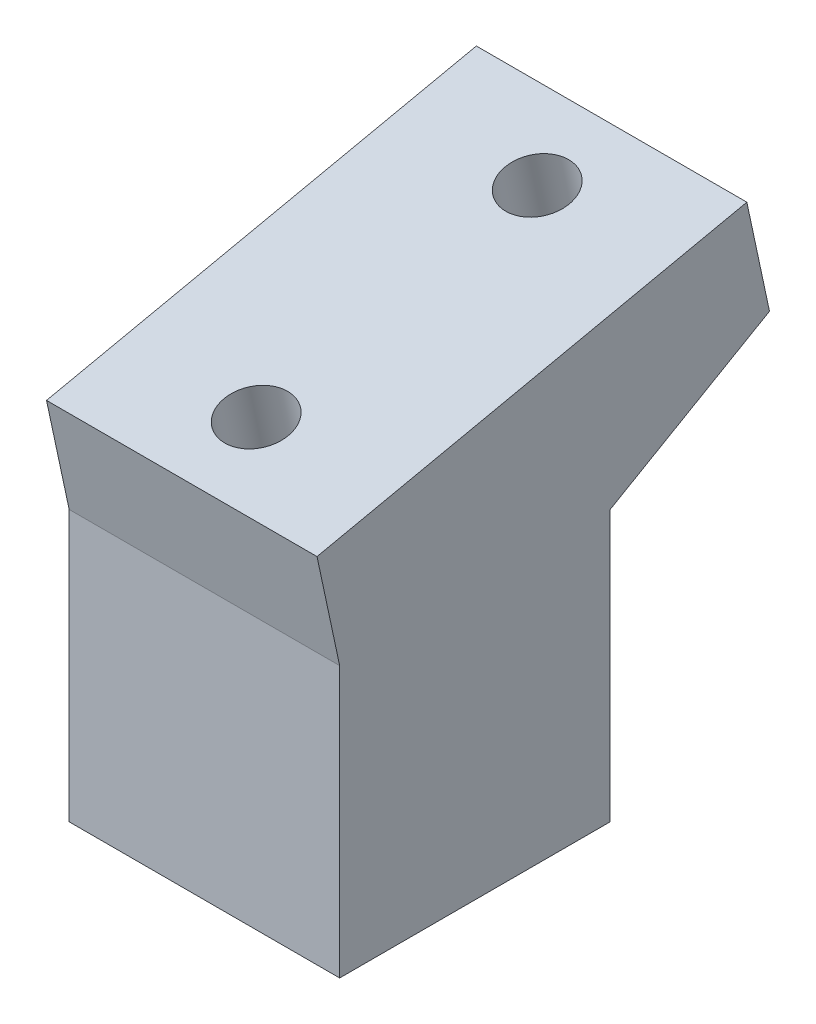
ISO-10303-21;
HEADER;
FILE_DESCRIPTION(('STEP AP214'),'2;1');
FILE_NAME('part.step','',(''),(''),'','','');
FILE_SCHEMA(('AUTOMOTIVE_DESIGN { 1 0 10303 214 1 1 1 1 }'));
ENDSEC;
DATA;
#1=APPLICATION_CONTEXT('core data for automotive mechanical design processes');
#2=APPLICATION_PROTOCOL_DEFINITION('international standard','automotive_design',2000,#1);
#3=PRODUCT_CONTEXT('',#1,'mechanical');
#4=PRODUCT('Part','Part','',(#3));
#5=PRODUCT_RELATED_PRODUCT_CATEGORY('part','',(#4));
#6=PRODUCT_DEFINITION_FORMATION('','',#4);
#7=PRODUCT_DEFINITION_CONTEXT('part definition',#1,'design');
#8=PRODUCT_DEFINITION('design','',#6,#7);
#9=PRODUCT_DEFINITION_SHAPE('','',#8);
#10=(LENGTH_UNIT() NAMED_UNIT(*) SI_UNIT(.MILLI.,.METRE.));
#11=(NAMED_UNIT(*) PLANE_ANGLE_UNIT() SI_UNIT($,.RADIAN.));
#12=(NAMED_UNIT(*) SI_UNIT($,.STERADIAN.) SOLID_ANGLE_UNIT());
#13=UNCERTAINTY_MEASURE_WITH_UNIT(LENGTH_MEASURE(1.E-05),#10,'distance_accuracy_value','');
#14=(GEOMETRIC_REPRESENTATION_CONTEXT(3) GLOBAL_UNCERTAINTY_ASSIGNED_CONTEXT((#13)) GLOBAL_UNIT_ASSIGNED_CONTEXT((#10,
#11,#12)) REPRESENTATION_CONTEXT('',''));
#15=CARTESIAN_POINT('',(0.,0.,0.));
#16=DIRECTION('',(0.,0.,1.));
#17=DIRECTION('',(1.,0.,0.));
#18=AXIS2_PLACEMENT_3D('',#15,#16,#17);
#19=CARTESIAN_POINT('',(0.,0.,0.));
#20=DIRECTION('',(0.,-1.,0.));
#21=DIRECTION('',(0.,0.,-1.));
#22=AXIS2_PLACEMENT_3D('',#19,#20,#21);
#23=PLANE('',#22);
#24=DIRECTION('',(0.,0.,1.));
#25=VECTOR('',#24,1.);
#26=CARTESIAN_POINT('',(0.,0.,0.));
#27=LINE('',#26,#25);
#28=CARTESIAN_POINT('',(0.,0.,-8.));
#29=VERTEX_POINT('',#28);
#30=CARTESIAN_POINT('',(0.,0.,0.));
#31=VERTEX_POINT('',#30);
#32=EDGE_CURVE('E249',#29,#31,#27,.T.);
#33=ORIENTED_EDGE('',*,*,#32,.F.);
#34=DIRECTION('',(-1.,0.,0.));
#35=VECTOR('',#34,1.);
#36=CARTESIAN_POINT('',(0.,0.,-8.));
#37=LINE('',#36,#35);
#38=CARTESIAN_POINT('',(8.,0.,-8.));
#39=VERTEX_POINT('',#38);
#40=EDGE_CURVE('E257',#39,#29,#37,.T.);
#41=ORIENTED_EDGE('',*,*,#40,.F.);
#42=DIRECTION('',(0.,0.,-1.));
#43=VECTOR('',#42,1.);
#44=CARTESIAN_POINT('',(8.,0.,0.));
#45=LINE('',#44,#43);
#46=CARTESIAN_POINT('',(8.,0.,0.));
#47=VERTEX_POINT('',#46);
#48=EDGE_CURVE('E260',#47,#39,#45,.T.);
#49=ORIENTED_EDGE('',*,*,#48,.F.);
#50=DIRECTION('',(1.,0.,0.));
#51=VECTOR('',#50,1.);
#52=CARTESIAN_POINT('',(0.,0.,0.));
#53=LINE('',#52,#51);
#54=EDGE_CURVE('E255',#31,#47,#53,.T.);
#55=ORIENTED_EDGE('',*,*,#54,.F.);
#56=EDGE_LOOP('',(#33,#41,#49,#55));
#57=FACE_BOUND('',#56,.T.);
#58=DIRECTION('',(-1.,0.,0.));
#59=VECTOR('',#58,1.);
#60=CARTESIAN_POINT('',(2.475,0.,-5.525));
#61=LINE('',#60,#59);
#62=CARTESIAN_POINT('',(5.525,0.,-5.525));
#63=VERTEX_POINT('',#62);
#64=CARTESIAN_POINT('',(2.475,0.,-5.525));
#65=VERTEX_POINT('',#64);
#66=EDGE_CURVE('E213',#63,#65,#61,.T.);
#67=ORIENTED_EDGE('',*,*,#66,.T.);
#68=DIRECTION('',(0.,0.,1.));
#69=VECTOR('',#68,1.);
#70=CARTESIAN_POINT('',(2.475,0.,-2.475));
#71=LINE('',#70,#69);
#72=CARTESIAN_POINT('',(2.475,0.,-2.475));
#73=VERTEX_POINT('',#72);
#74=EDGE_CURVE('E68',#65,#73,#71,.T.);
#75=ORIENTED_EDGE('',*,*,#74,.T.);
#76=DIRECTION('',(1.,0.,0.));
#77=VECTOR('',#76,1.);
#78=CARTESIAN_POINT('',(2.475,0.,-2.475));
#79=LINE('',#78,#77);
#80=CARTESIAN_POINT('',(5.525,0.,-2.475));
#81=VERTEX_POINT('',#80);
#82=EDGE_CURVE('E230',#73,#81,#79,.T.);
#83=ORIENTED_EDGE('',*,*,#82,.T.);
#84=DIRECTION('',(0.,0.,-1.));
#85=VECTOR('',#84,1.);
#86=CARTESIAN_POINT('',(5.525,0.,-2.475));
#87=LINE('',#86,#85);
#88=EDGE_CURVE('E235',#81,#63,#87,.T.);
#89=ORIENTED_EDGE('',*,*,#88,.T.);
#90=EDGE_LOOP('',(#67,#75,#83,#89));
#91=FACE_BOUND('',#90,.T.);
#92=ADVANCED_FACE('F50',(#57,#91),#23,.T.);
#93=CARTESIAN_POINT('',(0.,7.5,0.));
#94=DIRECTION('',(1.,0.,0.));
#95=DIRECTION('',(0.,0.,-1.));
#96=AXIS2_PLACEMENT_3D('',#93,#94,#95);
#97=PLANE('',#96);
#98=ORIENTED_EDGE('',*,*,#32,.T.);
#99=DIRECTION('',(0.,-1.,0.));
#100=VECTOR('',#99,1.);
#101=CARTESIAN_POINT('',(0.,7.5,0.));
#102=LINE('',#101,#100);
#103=CARTESIAN_POINT('',(0.,8.,0.));
#104=VERTEX_POINT('',#103);
#105=EDGE_CURVE('E139',#104,#31,#102,.T.);
#106=ORIENTED_EDGE('',*,*,#105,.F.);
#107=DIRECTION('',(0.,-0.977857126370329,-0.209273601791443));
#108=VECTOR('',#107,1.);
#109=CARTESIAN_POINT('',(0.,0.350363523254109,-1.63711746298359));
#110=LINE('',#109,#108);
#111=CARTESIAN_POINT('',(0.,11.1291428043851,0.669675525732618));
#112=VERTEX_POINT('',#111);
#113=EDGE_CURVE('E157',#112,#104,#110,.T.);
#114=ORIENTED_EDGE('',*,*,#113,.F.);
#115=DIRECTION('',(0.,-0.209273601791443,0.977857126370329));
#116=VECTOR('',#115,1.);
#117=CARTESIAN_POINT('',(0.,10.7787792811309,2.30679298871621));
#118=LINE('',#117,#116);
#119=CARTESIAN_POINT('',(0.,13.8496996276738,-12.0424671170816));
#120=VERTEX_POINT('',#119);
#121=EDGE_CURVE('E163',#120,#112,#118,.T.);
#122=ORIENTED_EDGE('',*,*,#121,.F.);
#123=DIRECTION('',(0.,0.977857126370328,0.209273601791444));
#124=VECTOR('',#123,1.);
#125=CARTESIAN_POINT('',(0.,3.07092034654288,-14.3492601057979));
#126=LINE('',#125,#124);
#127=CARTESIAN_POINT('',(0.,10.7205568232888,-12.7121426428143));
#128=VERTEX_POINT('',#127);
#129=EDGE_CURVE('E169',#128,#120,#126,.T.);
#130=ORIENTED_EDGE('',*,*,#129,.F.);
#131=DIRECTION('',(0.,-0.500000000000004,0.866025403784436));
#132=VECTOR('',#131,1.);
#133=CARTESIAN_POINT('',(0.,2.53589838486219,1.46410161513774));
#134=LINE('',#133,#132);
#135=CARTESIAN_POINT('',(0.,8.,-8.));
#136=VERTEX_POINT('',#135);
#137=EDGE_CURVE('E162',#128,#136,#134,.T.);
#138=ORIENTED_EDGE('',*,*,#137,.T.);
#139=DIRECTION('',(0.,-1.,0.));
#140=VECTOR('',#139,1.);
#141=CARTESIAN_POINT('',(0.,7.5,-8.));
#142=LINE('',#141,#140);
#143=EDGE_CURVE('E263',#136,#29,#142,.T.);
#144=ORIENTED_EDGE('',*,*,#143,.T.);
#145=EDGE_LOOP('',(#98,#106,#114,#122,#130,#138,#144));
#146=FACE_BOUND('',#145,.T.);
#147=ADVANCED_FACE('F47',(#146),#97,.F.);
#148=CARTESIAN_POINT('',(0.,7.5,0.));
#149=DIRECTION('',(0.,0.,-1.));
#150=DIRECTION('',(-1.,0.,0.));
#151=AXIS2_PLACEMENT_3D('',#148,#149,#150);
#152=PLANE('',#151);
#153=ORIENTED_EDGE('',*,*,#54,.T.);
#154=DIRECTION('',(0.,-1.,0.));
#155=VECTOR('',#154,1.);
#156=CARTESIAN_POINT('',(8.,7.5,0.));
#157=LINE('',#156,#155);
#158=CARTESIAN_POINT('',(8.,8.,0.));
#159=VERTEX_POINT('',#158);
#160=EDGE_CURVE('E271',#159,#47,#157,.T.);
#161=ORIENTED_EDGE('',*,*,#160,.F.);
#162=DIRECTION('',(1.,0.,0.));
#163=VECTOR('',#162,1.);
#164=CARTESIAN_POINT('',(0.,8.,0.));
#165=LINE('',#164,#163);
#166=EDGE_CURVE('E204',#104,#159,#165,.T.);
#167=ORIENTED_EDGE('',*,*,#166,.F.);
#168=ORIENTED_EDGE('',*,*,#105,.T.);
#169=EDGE_LOOP('',(#153,#161,#167,#168));
#170=FACE_BOUND('',#169,.T.);
#171=ADVANCED_FACE('F276',(#170),#152,.F.);
#172=CARTESIAN_POINT('',(8.,7.5,0.));
#173=DIRECTION('',(-1.,0.,0.));
#174=DIRECTION('',(0.,0.,1.));
#175=AXIS2_PLACEMENT_3D('',#172,#173,#174);
#176=PLANE('',#175);
#177=ORIENTED_EDGE('',*,*,#48,.T.);
#178=DIRECTION('',(0.,-1.,0.));
#179=VECTOR('',#178,1.);
#180=CARTESIAN_POINT('',(8.,7.5,-8.));
#181=LINE('',#180,#179);
#182=CARTESIAN_POINT('',(8.,8.,-8.));
#183=VERTEX_POINT('',#182);
#184=EDGE_CURVE('E270',#183,#39,#181,.T.);
#185=ORIENTED_EDGE('',*,*,#184,.F.);
#186=DIRECTION('',(0.,0.500000000000004,-0.866025403784436));
#187=VECTOR('',#186,1.);
#188=CARTESIAN_POINT('',(8.,2.53589838486219,1.46410161513774));
#189=LINE('',#188,#187);
#190=CARTESIAN_POINT('',(8.,10.7205568232888,-12.7121426428143));
#191=VERTEX_POINT('',#190);
#192=EDGE_CURVE('E183',#183,#191,#189,.T.);
#193=ORIENTED_EDGE('',*,*,#192,.T.);
#194=DIRECTION('',(0.,-0.977857126370329,-0.209273601791444));
#195=VECTOR('',#194,1.);
#196=CARTESIAN_POINT('',(8.,3.07092034654288,-14.3492601057979));
#197=LINE('',#196,#195);
#198=CARTESIAN_POINT('',(8.,13.8496996276738,-12.0424671170816));
#199=VERTEX_POINT('',#198);
#200=EDGE_CURVE('E175',#199,#191,#197,.T.);
#201=ORIENTED_EDGE('',*,*,#200,.F.);
#202=DIRECTION('',(0.,0.209273601791443,-0.977857126370329));
#203=VECTOR('',#202,1.);
#204=CARTESIAN_POINT('',(8.,10.7787792811309,2.30679298871621));
#205=LINE('',#204,#203);
#206=CARTESIAN_POINT('',(8.,11.1291428043851,0.669675525732618));
#207=VERTEX_POINT('',#206);
#208=EDGE_CURVE('E180',#207,#199,#205,.T.);
#209=ORIENTED_EDGE('',*,*,#208,.F.);
#210=DIRECTION('',(0.,0.977857126370329,0.209273601791443));
#211=VECTOR('',#210,1.);
#212=CARTESIAN_POINT('',(8.,0.350363523254109,-1.63711746298359));
#213=LINE('',#212,#211);
#214=EDGE_CURVE('E182',#159,#207,#213,.T.);
#215=ORIENTED_EDGE('',*,*,#214,.F.);
#216=ORIENTED_EDGE('',*,*,#160,.T.);
#217=EDGE_LOOP('',(#177,#185,#193,#201,#209,#215,#216));
#218=FACE_BOUND('',#217,.T.);
#219=ADVANCED_FACE('F287',(#218),#176,.F.);
#220=CARTESIAN_POINT('',(0.,7.5,-8.));
#221=DIRECTION('',(0.,0.,1.));
#222=DIRECTION('',(1.,0.,0.));
#223=AXIS2_PLACEMENT_3D('',#220,#221,#222);
#224=PLANE('',#223);
#225=ORIENTED_EDGE('',*,*,#40,.T.);
#226=ORIENTED_EDGE('',*,*,#143,.F.);
#227=DIRECTION('',(-1.,0.,0.));
#228=VECTOR('',#227,1.);
#229=CARTESIAN_POINT('',(8.,8.,-8.));
#230=LINE('',#229,#228);
#231=EDGE_CURVE('E171',#183,#136,#230,.T.);
#232=ORIENTED_EDGE('',*,*,#231,.F.);
#233=ORIENTED_EDGE('',*,*,#184,.T.);
#234=EDGE_LOOP('',(#225,#226,#232,#233));
#235=FACE_BOUND('',#234,.T.);
#236=ADVANCED_FACE('F295',(#235),#224,.F.);
#237=CARTESIAN_POINT('',(2.475,7.5,-2.475));
#238=DIRECTION('',(1.,0.,0.));
#239=DIRECTION('',(0.,0.,-1.));
#240=AXIS2_PLACEMENT_3D('',#237,#238,#239);
#241=PLANE('',#240);
#242=ORIENTED_EDGE('',*,*,#74,.F.);
#243=DIRECTION('',(0.,-1.,0.));
#244=VECTOR('',#243,1.);
#245=CARTESIAN_POINT('',(2.475,7.5,-5.525));
#246=LINE('',#245,#244);
#247=CARTESIAN_POINT('',(2.475,7.5,-5.525));
#248=VERTEX_POINT('',#247);
#249=EDGE_CURVE('E223',#248,#65,#246,.T.);
#250=ORIENTED_EDGE('',*,*,#249,.F.);
#251=DIRECTION('',(0.,0.,1.));
#252=VECTOR('',#251,1.);
#253=CARTESIAN_POINT('',(2.475,7.5,-2.475));
#254=LINE('',#253,#252);
#255=CARTESIAN_POINT('',(2.475,7.5,-2.475));
#256=VERTEX_POINT('',#255);
#257=EDGE_CURVE('E208',#248,#256,#254,.T.);
#258=ORIENTED_EDGE('',*,*,#257,.T.);
#259=DIRECTION('',(0.,-1.,0.));
#260=VECTOR('',#259,1.);
#261=CARTESIAN_POINT('',(2.475,7.5,-2.475));
#262=LINE('',#261,#260);
#263=EDGE_CURVE('E250',#256,#73,#262,.T.);
#264=ORIENTED_EDGE('',*,*,#263,.T.);
#265=EDGE_LOOP('',(#242,#250,#258,#264));
#266=FACE_BOUND('',#265,.T.);
#267=ADVANCED_FACE('F324',(#266),#241,.T.);
#268=CARTESIAN_POINT('',(2.475,7.5,-2.475));
#269=DIRECTION('',(0.,0.,-1.));
#270=DIRECTION('',(-1.,0.,0.));
#271=AXIS2_PLACEMENT_3D('',#268,#269,#270);
#272=PLANE('',#271);
#273=ORIENTED_EDGE('',*,*,#82,.F.);
#274=ORIENTED_EDGE('',*,*,#263,.F.);
#275=DIRECTION('',(1.,0.,0.));
#276=VECTOR('',#275,1.);
#277=CARTESIAN_POINT('',(2.475,7.5,-2.475));
#278=LINE('',#277,#276);
#279=CARTESIAN_POINT('',(5.525,7.5,-2.475));
#280=VERTEX_POINT('',#279);
#281=EDGE_CURVE('E215',#256,#280,#278,.T.);
#282=ORIENTED_EDGE('',*,*,#281,.T.);
#283=DIRECTION('',(0.,-1.,0.));
#284=VECTOR('',#283,1.);
#285=CARTESIAN_POINT('',(5.525,7.5,-2.475));
#286=LINE('',#285,#284);
#287=EDGE_CURVE('E243',#280,#81,#286,.T.);
#288=ORIENTED_EDGE('',*,*,#287,.T.);
#289=EDGE_LOOP('',(#273,#274,#282,#288));
#290=FACE_BOUND('',#289,.T.);
#291=ADVANCED_FACE('F393',(#290),#272,.T.);
#292=CARTESIAN_POINT('',(5.525,7.5,-2.475));
#293=DIRECTION('',(-1.,0.,0.));
#294=DIRECTION('',(0.,0.,1.));
#295=AXIS2_PLACEMENT_3D('',#292,#293,#294);
#296=PLANE('',#295);
#297=ORIENTED_EDGE('',*,*,#88,.F.);
#298=ORIENTED_EDGE('',*,*,#287,.F.);
#299=DIRECTION('',(0.,0.,-1.));
#300=VECTOR('',#299,1.);
#301=CARTESIAN_POINT('',(5.525,7.5,-2.475));
#302=LINE('',#301,#300);
#303=CARTESIAN_POINT('',(5.525,7.5,-5.525));
#304=VERTEX_POINT('',#303);
#305=EDGE_CURVE('E220',#280,#304,#302,.T.);
#306=ORIENTED_EDGE('',*,*,#305,.T.);
#307=DIRECTION('',(0.,-1.,0.));
#308=VECTOR('',#307,1.);
#309=CARTESIAN_POINT('',(5.525,7.5,-5.525));
#310=LINE('',#309,#308);
#311=EDGE_CURVE('E244',#304,#63,#310,.T.);
#312=ORIENTED_EDGE('',*,*,#311,.T.);
#313=EDGE_LOOP('',(#297,#298,#306,#312));
#314=FACE_BOUND('',#313,.T.);
#315=ADVANCED_FACE('F383',(#314),#296,.T.);
#316=CARTESIAN_POINT('',(2.475,7.5,-5.525));
#317=DIRECTION('',(0.,0.,1.));
#318=DIRECTION('',(1.,0.,0.));
#319=AXIS2_PLACEMENT_3D('',#316,#317,#318);
#320=PLANE('',#319);
#321=ORIENTED_EDGE('',*,*,#66,.F.);
#322=ORIENTED_EDGE('',*,*,#311,.F.);
#323=DIRECTION('',(-1.,0.,0.));
#324=VECTOR('',#323,1.);
#325=CARTESIAN_POINT('',(2.475,7.5,-5.525));
#326=LINE('',#325,#324);
#327=EDGE_CURVE('E222',#304,#248,#326,.T.);
#328=ORIENTED_EDGE('',*,*,#327,.T.);
#329=ORIENTED_EDGE('',*,*,#249,.T.);
#330=EDGE_LOOP('',(#321,#322,#328,#329));
#331=FACE_BOUND('',#330,.T.);
#332=ADVANCED_FACE('F362',(#331),#320,.T.);
#333=CARTESIAN_POINT('',(0.,7.5,0.));
#334=DIRECTION('',(0.,1.,0.));
#335=DIRECTION('',(0.,0.,1.));
#336=AXIS2_PLACEMENT_3D('',#333,#334,#335);
#337=PLANE('',#336);
#338=ORIENTED_EDGE('',*,*,#257,.F.);
#339=ORIENTED_EDGE('',*,*,#327,.F.);
#340=ORIENTED_EDGE('',*,*,#305,.F.);
#341=ORIENTED_EDGE('',*,*,#281,.F.);
#342=EDGE_LOOP('',(#338,#339,#340,#341));
#343=FACE_BOUND('',#342,.T.);
#344=ADVANCED_FACE('F314',(#343),#337,.F.);
#345=CARTESIAN_POINT('',(-14.6045213283441,10.7787792811309,2.30679298871621));
#346=DIRECTION('',(0.,-0.977857126370328,-0.209273601791443));
#347=DIRECTION('',(0.,0.209273601791443,-0.977857126370329));
#348=AXIS2_PLACEMENT_3D('',#345,#346,#347);
#349=PLANE('',#348);
#350=CARTESIAN_POINT('',(4.,11.6000084084158,-1.53050300860062));
#351=DIRECTION('',(0.,0.977857126370328,0.209273601791443));
#352=DIRECTION('',(0.,-0.209273601791443,0.977857126370328));
#353=AXIS2_PLACEMENT_3D('',#350,#351,#352);
#354=CIRCLE('',#353,0.95);
#355=CARTESIAN_POINT('',(4.,11.4011984867139,-0.601538738548805));
#356=VERTEX_POINT('',#355);
#357=EDGE_CURVE('E150',#356,#356,#354,.T.);
#358=ORIENTED_EDGE('',*,*,#357,.F.);
#359=EDGE_LOOP('',(#358));
#360=FACE_BOUND('',#359,.T.);
#361=CARTESIAN_POINT('',(4.,13.3788340236431,-9.84228858274841));
#362=DIRECTION('',(0.,0.977857126370328,0.209273601791443));
#363=DIRECTION('',(0.,0.209273601791443,-0.977857126370328));
#364=AXIS2_PLACEMENT_3D('',#361,#362,#363);
#365=CIRCLE('',#364,0.95);
#366=CARTESIAN_POINT('',(4.,13.5776439453449,-10.7712528528002));
#367=VERTEX_POINT('',#366);
#368=EDGE_CURVE('E146',#367,#367,#365,.T.);
#369=ORIENTED_EDGE('',*,*,#368,.F.);
#370=EDGE_LOOP('',(#369));
#371=FACE_BOUND('',#370,.T.);
#372=DIRECTION('',(1.,0.,0.));
#373=VECTOR('',#372,1.);
#374=CARTESIAN_POINT('',(-14.6045213283441,13.8496996276738,-12.0424671170816));
#375=LINE('',#374,#373);
#376=EDGE_CURVE('E188',#120,#199,#375,.T.);
#377=ORIENTED_EDGE('',*,*,#376,.F.);
#378=ORIENTED_EDGE('',*,*,#121,.T.);
#379=DIRECTION('',(1.,0.,0.));
#380=VECTOR('',#379,1.);
#381=CARTESIAN_POINT('',(-14.6045213283441,11.1291428043851,0.669675525732618));
#382=LINE('',#381,#380);
#383=EDGE_CURVE('E192',#112,#207,#382,.T.);
#384=ORIENTED_EDGE('',*,*,#383,.T.);
#385=ORIENTED_EDGE('',*,*,#208,.T.);
#386=EDGE_LOOP('',(#377,#378,#384,#385));
#387=FACE_BOUND('',#386,.T.);
#388=ADVANCED_FACE('F301',(#360,#371,#387),#349,.F.);
#389=CARTESIAN_POINT('',(-14.6045213283441,0.350363523254109,-1.63711746298359));
#390=DIRECTION('',(0.,0.209273601791443,-0.977857126370328));
#391=DIRECTION('',(0.,0.977857126370329,0.209273601791443));
#392=AXIS2_PLACEMENT_3D('',#389,#390,#391);
#393=PLANE('',#392);
#394=ORIENTED_EDGE('',*,*,#383,.F.);
#395=ORIENTED_EDGE('',*,*,#113,.T.);
#396=ORIENTED_EDGE('',*,*,#166,.T.);
#397=ORIENTED_EDGE('',*,*,#214,.T.);
#398=EDGE_LOOP('',(#394,#395,#396,#397));
#399=FACE_BOUND('',#398,.T.);
#400=ADVANCED_FACE('F303',(#399),#393,.F.);
#401=CARTESIAN_POINT('',(-14.6045213283441,2.53589838486219,1.46410161513774));
#402=DIRECTION('',(0.,-0.866025403784436,-0.500000000000004));
#403=DIRECTION('',(0.,0.500000000000004,-0.866025403784436));
#404=AXIS2_PLACEMENT_3D('',#401,#402,#403);
#405=PLANE('',#404);
#406=CARTESIAN_POINT('',(4.,9.53819565123663,-10.6642330199233));
#407=DIRECTION('',(0.,-0.866025403784436,-0.500000000000004));
#408=DIRECTION('',(0.,0.500000000000004,-0.866025403784436));
#409=AXIS2_PLACEMENT_3D('',#406,#407,#408);
#410=ELLIPSE('',#409,0.998438323066238,0.95);
#411=CARTESIAN_POINT('',(3.56070341856591,9.09555682328877,-9.89756008051489));
#412=VERTEX_POINT('',#411);
#413=CARTESIAN_POINT('',(4.43929658143409,9.09555682328877,-9.89756008051489));
#414=VERTEX_POINT('',#413);
#415=EDGE_CURVE('E57',#412,#414,#410,.T.);
#416=ORIENTED_EDGE('',*,*,#415,.F.);
#417=DIRECTION('',(-1.,0.,0.));
#418=VECTOR('',#417,1.);
#419=CARTESIAN_POINT('',(-14.6045213283441,9.09555682328877,-9.89756008051489));
#420=LINE('',#419,#418);
#421=EDGE_CURVE('E11',#414,#412,#420,.T.);
#422=ORIENTED_EDGE('',*,*,#421,.F.);
#423=EDGE_LOOP('',(#416,#422));
#424=FACE_BOUND('',#423,.T.);
#425=ORIENTED_EDGE('',*,*,#137,.F.);
#426=DIRECTION('',(1.,0.,0.));
#427=VECTOR('',#426,1.);
#428=CARTESIAN_POINT('',(-14.6045213283441,10.7205568232888,-12.7121426428143));
#429=LINE('',#428,#427);
#430=EDGE_CURVE('E187',#128,#191,#429,.T.);
#431=ORIENTED_EDGE('',*,*,#430,.T.);
#432=ORIENTED_EDGE('',*,*,#192,.F.);
#433=ORIENTED_EDGE('',*,*,#231,.T.);
#434=EDGE_LOOP('',(#425,#431,#432,#433));
#435=FACE_BOUND('',#434,.T.);
#436=ADVANCED_FACE('F140',(#424,#435),#405,.T.);
#437=CARTESIAN_POINT('',(-14.6045213283441,3.07092034654288,-14.3492601057979));
#438=DIRECTION('',(0.,-0.209273601791444,0.977857126370328));
#439=DIRECTION('',(0.,-0.977857126370328,-0.209273601791444));
#440=AXIS2_PLACEMENT_3D('',#437,#438,#439);
#441=PLANE('',#440);
#442=ORIENTED_EDGE('',*,*,#430,.F.);
#443=ORIENTED_EDGE('',*,*,#129,.T.);
#444=ORIENTED_EDGE('',*,*,#376,.T.);
#445=ORIENTED_EDGE('',*,*,#200,.T.);
#446=EDGE_LOOP('',(#442,#443,#444,#445));
#447=FACE_BOUND('',#446,.T.);
#448=ADVANCED_FACE('F300',(#447),#441,.F.);
#449=CARTESIAN_POINT('',(4.,9.27183409288769,-10.7212377102725));
#450=DIRECTION('',(0.,0.977857126370329,0.209273601791443));
#451=DIRECTION('',(0.,-0.209273601791443,0.977857126370329));
#452=AXIS2_PLACEMENT_3D('',#449,#450,#451);
#453=CYLINDRICAL_SURFACE('',#452,0.95);
#454=CARTESIAN_POINT('',(4.,9.27183409288769,-10.7212377102725));
#455=DIRECTION('',(0.,0.977857126370328,0.209273601791443));
#456=DIRECTION('',(0.,0.209273601791443,-0.977857126370328));
#457=AXIS2_PLACEMENT_3D('',#454,#455,#456);
#458=CIRCLE('',#457,0.95);
#459=EDGE_CURVE('E141',#412,#414,#458,.T.);
#460=ORIENTED_EDGE('',*,*,#459,.F.);
#461=ORIENTED_EDGE('',*,*,#415,.T.);
#462=EDGE_LOOP('',(#460,#461));
#463=FACE_BOUND('',#462,.T.);
#464=ORIENTED_EDGE('',*,*,#368,.T.);
#465=EDGE_LOOP('',(#464));
#466=FACE_BOUND('',#465,.T.);
#467=ADVANCED_FACE('F145',(#463,#466),#453,.F.);
#468=CARTESIAN_POINT('',(4.,9.27183409288769,-10.7212377102725));
#469=DIRECTION('',(0.,-0.977857126370328,-0.209273601791443));
#470=DIRECTION('',(0.,0.209273601791443,-0.977857126370328));
#471=AXIS2_PLACEMENT_3D('',#468,#469,#470);
#472=PLANE('',#471);
#473=ORIENTED_EDGE('',*,*,#421,.T.);
#474=ORIENTED_EDGE('',*,*,#459,.T.);
#475=EDGE_LOOP('',(#473,#474));
#476=FACE_BOUND('',#475,.T.);
#477=ADVANCED_FACE('F142',(#476),#472,.F.);
#478=CARTESIAN_POINT('',(4.,7.49300847766042,-2.40945213612468));
#479=DIRECTION('',(0.,0.977857126370329,0.209273601791443));
#480=DIRECTION('',(0.,-0.209273601791443,0.977857126370329));
#481=AXIS2_PLACEMENT_3D('',#478,#479,#480);
#482=CYLINDRICAL_SURFACE('',#481,0.95);
#483=CARTESIAN_POINT('',(4.,7.49300847766042,-2.40945213612468));
#484=DIRECTION('',(0.,0.977857126370328,0.209273601791443));
#485=DIRECTION('',(0.,-0.209273601791443,0.977857126370328));
#486=AXIS2_PLACEMENT_3D('',#483,#484,#485);
#487=CIRCLE('',#486,0.95);
#488=CARTESIAN_POINT('',(4.,7.29419855595855,-1.48048786607287));
#489=VERTEX_POINT('',#488);
#490=EDGE_CURVE('E153',#489,#489,#487,.T.);
#491=ORIENTED_EDGE('',*,*,#490,.F.);
#492=EDGE_LOOP('',(#491));
#493=FACE_BOUND('',#492,.T.);
#494=ORIENTED_EDGE('',*,*,#357,.T.);
#495=EDGE_LOOP('',(#494));
#496=FACE_BOUND('',#495,.T.);
#497=ADVANCED_FACE('F433',(#493,#496),#482,.F.);
#498=CARTESIAN_POINT('',(4.,7.49300847766042,-2.40945213612468));
#499=DIRECTION('',(0.,0.977857126370328,0.209273601791443));
#500=DIRECTION('',(0.,-0.209273601791443,0.977857126370328));
#501=AXIS2_PLACEMENT_3D('',#498,#499,#500);
#502=PLANE('',#501);
#503=ORIENTED_EDGE('',*,*,#490,.T.);
#504=EDGE_LOOP('',(#503));
#505=FACE_BOUND('',#504,.T.);
#506=ADVANCED_FACE('F437',(#505),#502,.T.);
#507=CLOSED_SHELL('',(#92,#147,#171,#219,#236,#267,#291,#315,#332,#344,#388,#400,#436,#448,#467,
#477,#497,#506));
#508=MANIFOLD_SOLID_BREP('B2',#507);
#509=ADVANCED_BREP_SHAPE_REPRESENTATION('',(#18,#508),#14);
#510=SHAPE_DEFINITION_REPRESENTATION(#9,#509);
ENDSEC;
END-ISO-10303-21;
